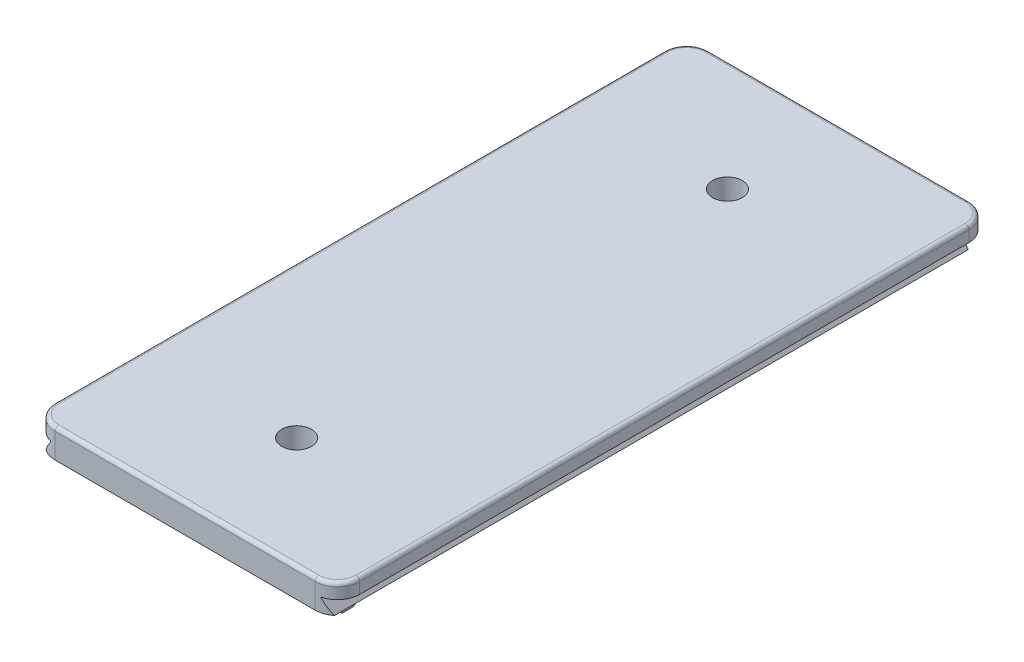
ISO-10303-21;
HEADER;
FILE_DESCRIPTION(('STEP AP214'),'2;1');
FILE_NAME('part.step','',(''),(''),'','','');
FILE_SCHEMA(('AUTOMOTIVE_DESIGN { 1 0 10303 214 1 1 1 1 }'));
ENDSEC;
DATA;
#1=APPLICATION_CONTEXT('core data for automotive mechanical design processes');
#2=APPLICATION_PROTOCOL_DEFINITION('international standard','automotive_design',2000,#1);
#3=PRODUCT_CONTEXT('',#1,'mechanical');
#4=PRODUCT('Part','Part','',(#3));
#5=PRODUCT_RELATED_PRODUCT_CATEGORY('part','',(#4));
#6=PRODUCT_DEFINITION_FORMATION('','',#4);
#7=PRODUCT_DEFINITION_CONTEXT('part definition',#1,'design');
#8=PRODUCT_DEFINITION('design','',#6,#7);
#9=PRODUCT_DEFINITION_SHAPE('','',#8);
#10=(LENGTH_UNIT() NAMED_UNIT(*) SI_UNIT(.MILLI.,.METRE.));
#11=(NAMED_UNIT(*) PLANE_ANGLE_UNIT() SI_UNIT($,.RADIAN.));
#12=(NAMED_UNIT(*) SI_UNIT($,.STERADIAN.) SOLID_ANGLE_UNIT());
#13=UNCERTAINTY_MEASURE_WITH_UNIT(LENGTH_MEASURE(1.E-05),#10,'distance_accuracy_value','');
#14=(GEOMETRIC_REPRESENTATION_CONTEXT(3) GLOBAL_UNCERTAINTY_ASSIGNED_CONTEXT((#13)) GLOBAL_UNIT_ASSIGNED_CONTEXT((#10,
#11,#12)) REPRESENTATION_CONTEXT('',''));
#15=CARTESIAN_POINT('',(0.,0.,0.));
#16=DIRECTION('',(0.,0.,1.));
#17=DIRECTION('',(1.,0.,0.));
#18=AXIS2_PLACEMENT_3D('',#15,#16,#17);
#19=CARTESIAN_POINT('',(19.4201695446766,24.25,-127.180365467052));
#20=DIRECTION('',(0.,-1.,0.));
#21=DIRECTION('',(1.,0.,0.));
#22=AXIS2_PLACEMENT_3D('',#19,#20,#21);
#23=PLANE('',#22);
#24=CARTESIAN_POINT('',(0.,24.25,-73.));
#25=DIRECTION('',(0.,-1.,0.));
#26=DIRECTION('',(1.,0.,0.));
#27=AXIS2_PLACEMENT_3D('',#24,#25,#26);
#28=CIRCLE('',#27,2.);
#29=CARTESIAN_POINT('',(2.,24.25,-73.));
#30=VERTEX_POINT('',#29);
#31=EDGE_CURVE('E387',#30,#30,#28,.F.);
#32=ORIENTED_EDGE('',*,*,#31,.T.);
#33=EDGE_LOOP('',(#32));
#34=FACE_BOUND('',#33,.T.);
#35=CARTESIAN_POINT('',(0.,24.25,-15.));
#36=DIRECTION('',(0.,-1.,0.));
#37=DIRECTION('',(1.,0.,0.));
#38=AXIS2_PLACEMENT_3D('',#35,#36,#37);
#39=CIRCLE('',#38,2.);
#40=CARTESIAN_POINT('',(1.99999999999999,24.25,-15.));
#41=VERTEX_POINT('',#40);
#42=EDGE_CURVE('E382',#41,#41,#39,.F.);
#43=ORIENTED_EDGE('',*,*,#42,.T.);
#44=EDGE_LOOP('',(#43));
#45=FACE_BOUND('',#44,.T.);
#46=DIRECTION('',(1.,0.,0.));
#47=VECTOR('',#46,1.);
#48=CARTESIAN_POINT('',(19.4201695446766,24.25,-3.5));
#49=LINE('',#48,#47);
#50=CARTESIAN_POINT('',(-19.4201695446767,24.25,-3.5));
#51=VERTEX_POINT('',#50);
#52=CARTESIAN_POINT('',(19.4201695446766,24.25,-3.5));
#53=VERTEX_POINT('',#52);
#54=EDGE_CURVE('E213',#51,#53,#49,.T.);
#55=ORIENTED_EDGE('',*,*,#54,.F.);
#56=DIRECTION('',(0.,0.,1.));
#57=VECTOR('',#56,1.);
#58=CARTESIAN_POINT('',(-19.4201695446767,24.25,-127.180365467052));
#59=LINE('',#58,#57);
#60=CARTESIAN_POINT('',(-19.4201695446767,24.25,-86.));
#61=VERTEX_POINT('',#60);
#62=EDGE_CURVE('E212',#61,#51,#59,.T.);
#63=ORIENTED_EDGE('',*,*,#62,.F.);
#64=DIRECTION('',(-1.,0.,0.));
#65=VECTOR('',#64,1.);
#66=CARTESIAN_POINT('',(19.4201695446766,24.25,-86.));
#67=LINE('',#66,#65);
#68=CARTESIAN_POINT('',(19.4201695446766,24.25,-86.));
#69=VERTEX_POINT('',#68);
#70=EDGE_CURVE('E252',#69,#61,#67,.T.);
#71=ORIENTED_EDGE('',*,*,#70,.F.);
#72=DIRECTION('',(0.,0.,1.));
#73=VECTOR('',#72,1.);
#74=CARTESIAN_POINT('',(19.4201695446766,24.25,-127.180365467052));
#75=LINE('',#74,#73);
#76=EDGE_CURVE('E262',#69,#53,#75,.T.);
#77=ORIENTED_EDGE('',*,*,#76,.T.);
#78=EDGE_LOOP('',(#55,#63,#71,#77));
#79=FACE_BOUND('',#78,.T.);
#80=ADVANCED_FACE('F39',(#34,#45,#79),#23,.T.);
#81=CARTESIAN_POINT('',(18.5,26.,-86.));
#82=DIRECTION('',(0.,0.,1.));
#83=DIRECTION('',(1.,0.,0.));
#84=AXIS2_PLACEMENT_3D('',#81,#82,#83);
#85=PLANE('',#84);
#86=DIRECTION('',(-1.,0.,0.));
#87=VECTOR('',#86,1.);
#88=CARTESIAN_POINT('',(-20.5,26.1,-86.));
#89=LINE('',#88,#87);
#90=CARTESIAN_POINT('',(18.1948063528096,26.1,-86.));
#91=VERTEX_POINT('',#90);
#92=CARTESIAN_POINT('',(-18.1948063528096,26.1,-86.));
#93=VERTEX_POINT('',#92);
#94=EDGE_CURVE('E238',#91,#93,#89,.T.);
#95=ORIENTED_EDGE('',*,*,#94,.F.);
#96=DIRECTION('',(0.,-1.,0.));
#97=VECTOR('',#96,1.);
#98=CARTESIAN_POINT('',(18.1948063528096,26.,-86.));
#99=LINE('',#98,#97);
#100=CARTESIAN_POINT('',(18.1948063528096,26.,-86.));
#101=VERTEX_POINT('',#100);
#102=EDGE_CURVE('E242',#91,#101,#99,.T.);
#103=ORIENTED_EDGE('',*,*,#102,.T.);
#104=DIRECTION('',(0.573576436351041,-0.819152044288995,0.));
#105=VECTOR('',#104,1.);
#106=CARTESIAN_POINT('',(18.1948063528096,26.,-86.));
#107=LINE('',#106,#105);
#108=EDGE_CURVE('E254',#101,#69,#107,.T.);
#109=ORIENTED_EDGE('',*,*,#108,.T.);
#110=ORIENTED_EDGE('',*,*,#70,.T.);
#111=DIRECTION('',(0.573576436351057,0.819152044288984,0.));
#112=VECTOR('',#111,1.);
#113=CARTESIAN_POINT('',(-19.4201695446767,24.25,-86.));
#114=LINE('',#113,#112);
#115=CARTESIAN_POINT('',(-18.1948063528096,26.,-86.));
#116=VERTEX_POINT('',#115);
#117=EDGE_CURVE('E249',#61,#116,#114,.T.);
#118=ORIENTED_EDGE('',*,*,#117,.T.);
#119=DIRECTION('',(0.,1.,0.));
#120=VECTOR('',#119,1.);
#121=CARTESIAN_POINT('',(-18.1948063528096,26.,-86.));
#122=LINE('',#121,#120);
#123=EDGE_CURVE('E247',#116,#93,#122,.T.);
#124=ORIENTED_EDGE('',*,*,#123,.T.);
#125=EDGE_LOOP('',(#95,#103,#109,#110,#118,#124));
#126=FACE_BOUND('',#125,.T.);
#127=ADVANCED_FACE('F408',(#126),#85,.F.);
#128=CARTESIAN_POINT('',(18.1948063528096,26.,-127.180365467052));
#129=DIRECTION('',(1.,0.,0.));
#130=DIRECTION('',(0.,1.,0.));
#131=AXIS2_PLACEMENT_3D('',#128,#129,#130);
#132=PLANE('',#131);
#133=DIRECTION('',(0.,0.,1.));
#134=VECTOR('',#133,1.);
#135=CARTESIAN_POINT('',(18.1948063528096,26.1,-127.180365467052));
#136=LINE('',#135,#134);
#137=CARTESIAN_POINT('',(18.1948063528096,26.1,-0.0815682067083767));
#138=VERTEX_POINT('',#137);
#139=EDGE_CURVE('E259',#91,#138,#136,.T.);
#140=ORIENTED_EDGE('',*,*,#139,.T.);
#141=DIRECTION('',(0.,-1.,0.));
#142=VECTOR('',#141,1.);
#143=CARTESIAN_POINT('',(18.1948063528096,26.1,-0.081568206708378));
#144=LINE('',#143,#142);
#145=CARTESIAN_POINT('',(18.1948063528096,26.,-0.0815682067083767));
#146=VERTEX_POINT('',#145);
#147=EDGE_CURVE('E319',#138,#146,#144,.T.);
#148=ORIENTED_EDGE('',*,*,#147,.T.);
#149=DIRECTION('',(0.,0.,1.));
#150=VECTOR('',#149,1.);
#151=CARTESIAN_POINT('',(18.1948063528096,26.,-127.180365467052));
#152=LINE('',#151,#150);
#153=EDGE_CURVE('E250',#101,#146,#152,.T.);
#154=ORIENTED_EDGE('',*,*,#153,.F.);
#155=ORIENTED_EDGE('',*,*,#102,.F.);
#156=EDGE_LOOP('',(#140,#148,#154,#155));
#157=FACE_BOUND('',#156,.T.);
#158=ADVANCED_FACE('F486',(#157),#132,.T.);
#159=CARTESIAN_POINT('',(18.1948063528096,26.,-127.180365467052));
#160=DIRECTION('',(0.819152044288995,0.573576436351041,0.));
#161=DIRECTION('',(-0.573576436351041,0.819152044288995,0.));
#162=AXIS2_PLACEMENT_3D('',#159,#160,#161);
#163=PLANE('',#162);
#164=ORIENTED_EDGE('',*,*,#153,.T.);
#165=CARTESIAN_POINT('',(17.5,26.9922863078369,-3.));
#166=DIRECTION('',(0.819152044288995,0.573576436351041,0.));
#167=DIRECTION('',(0.573576436351041,-0.819152044288995,0.));
#168=AXIS2_PLACEMENT_3D('',#165,#166,#167);
#169=ELLIPSE('',#168,5.23034038686334,3.);
#170=CARTESIAN_POINT('',(19.4201695446766,24.25,-0.69501650337872));
#171=VERTEX_POINT('',#170);
#172=EDGE_CURVE('E321',#146,#171,#169,.T.);
#173=ORIENTED_EDGE('',*,*,#172,.T.);
#174=CARTESIAN_POINT('',(19.4201695446766,24.25,-1.5));
#175=VERTEX_POINT('',#174);
#176=EDGE_CURVE('E264',#175,#171,#75,.T.);
#177=ORIENTED_EDGE('',*,*,#176,.F.);
#178=DIRECTION('',(0.,0.,1.));
#179=VECTOR('',#178,1.);
#180=CARTESIAN_POINT('',(19.4201695446766,24.25,-1.5));
#181=LINE('',#180,#179);
#182=EDGE_CURVE('E228',#53,#175,#181,.T.);
#183=ORIENTED_EDGE('',*,*,#182,.F.);
#184=ORIENTED_EDGE('',*,*,#76,.F.);
#185=ORIENTED_EDGE('',*,*,#108,.F.);
#186=EDGE_LOOP('',(#164,#173,#177,#183,#184,#185));
#187=FACE_BOUND('',#186,.T.);
#188=ADVANCED_FACE('F403',(#187),#163,.T.);
#189=DIRECTION('',(1.,0.,0.));
#190=VECTOR('',#189,1.);
#191=CARTESIAN_POINT('',(19.4201695446766,24.25,0.));
#192=LINE('',#191,#190);
#193=CARTESIAN_POINT('',(-17.5,24.25,0.));
#194=VERTEX_POINT('',#193);
#195=CARTESIAN_POINT('',(17.5,24.25,0.));
#196=VERTEX_POINT('',#195);
#197=EDGE_CURVE('E246',#194,#196,#192,.T.);
#198=ORIENTED_EDGE('',*,*,#197,.F.);
#199=CARTESIAN_POINT('',(-17.5,24.25,-3.));
#200=DIRECTION('',(0.,-1.,0.));
#201=DIRECTION('',(1.,0.,0.));
#202=AXIS2_PLACEMENT_3D('',#199,#200,#201);
#203=CIRCLE('',#202,3.);
#204=CARTESIAN_POINT('',(-19.4201695446767,24.25,-0.695016503378776));
#205=VERTEX_POINT('',#204);
#206=EDGE_CURVE('E222',#194,#205,#203,.T.);
#207=ORIENTED_EDGE('',*,*,#206,.T.);
#208=CARTESIAN_POINT('',(-19.4201695446766,24.25,-1.5));
#209=VERTEX_POINT('',#208);
#210=EDGE_CURVE('E208',#209,#205,#59,.T.);
#211=ORIENTED_EDGE('',*,*,#210,.F.);
#212=DIRECTION('',(-1.,0.,0.));
#213=VECTOR('',#212,1.);
#214=CARTESIAN_POINT('',(19.4201695446766,24.25,-1.5));
#215=LINE('',#214,#213);
#216=EDGE_CURVE('E214',#175,#209,#215,.T.);
#217=ORIENTED_EDGE('',*,*,#216,.F.);
#218=ORIENTED_EDGE('',*,*,#176,.T.);
#219=CARTESIAN_POINT('',(17.5,24.25,-3.));
#220=DIRECTION('',(0.,-1.,0.));
#221=DIRECTION('',(1.,0.,0.));
#222=AXIS2_PLACEMENT_3D('',#219,#220,#221);
#223=CIRCLE('',#222,3.);
#224=EDGE_CURVE('E312',#171,#196,#223,.T.);
#225=ORIENTED_EDGE('',*,*,#224,.T.);
#226=EDGE_LOOP('',(#198,#207,#211,#217,#218,#225));
#227=FACE_BOUND('',#226,.T.);
#228=ADVANCED_FACE('F218',(#227),#23,.T.);
#229=CARTESIAN_POINT('',(-19.4201695446767,24.25,-127.180365467052));
#230=DIRECTION('',(-0.819152044288984,0.573576436351057,0.));
#231=DIRECTION('',(-0.573576436351057,-0.819152044288984,0.));
#232=AXIS2_PLACEMENT_3D('',#229,#230,#231);
#233=PLANE('',#232);
#234=ORIENTED_EDGE('',*,*,#210,.T.);
#235=CARTESIAN_POINT('',(-17.5,26.9922863078368,-3.));
#236=DIRECTION('',(-0.819152044288984,0.573576436351057,0.));
#237=DIRECTION('',(0.573576436351057,0.819152044288984,0.));
#238=AXIS2_PLACEMENT_3D('',#235,#236,#237);
#239=ELLIPSE('',#238,5.23034038686319,3.);
#240=CARTESIAN_POINT('',(-18.1948063528096,26.,-0.0815682067083767));
#241=VERTEX_POINT('',#240);
#242=EDGE_CURVE('E315',#205,#241,#239,.T.);
#243=ORIENTED_EDGE('',*,*,#242,.T.);
#244=DIRECTION('',(0.,0.,1.));
#245=VECTOR('',#244,1.);
#246=CARTESIAN_POINT('',(-18.1948063528096,26.,-127.180365467052));
#247=LINE('',#246,#245);
#248=EDGE_CURVE('E223',#116,#241,#247,.T.);
#249=ORIENTED_EDGE('',*,*,#248,.F.);
#250=ORIENTED_EDGE('',*,*,#117,.F.);
#251=ORIENTED_EDGE('',*,*,#62,.T.);
#252=DIRECTION('',(0.,0.,-1.));
#253=VECTOR('',#252,1.);
#254=CARTESIAN_POINT('',(-19.4201695446766,24.25,-3.5));
#255=LINE('',#254,#253);
#256=EDGE_CURVE('E192',#209,#51,#255,.T.);
#257=ORIENTED_EDGE('',*,*,#256,.F.);
#258=EDGE_LOOP('',(#234,#243,#249,#250,#251,#257));
#259=FACE_BOUND('',#258,.T.);
#260=ADVANCED_FACE('F207',(#259),#233,.T.);
#261=CARTESIAN_POINT('',(-18.1948063528096,26.,-127.180365467052));
#262=DIRECTION('',(-1.,0.,0.));
#263=DIRECTION('',(0.,0.,1.));
#264=AXIS2_PLACEMENT_3D('',#261,#262,#263);
#265=PLANE('',#264);
#266=ORIENTED_EDGE('',*,*,#248,.T.);
#267=DIRECTION('',(0.,1.,0.));
#268=VECTOR('',#267,1.);
#269=CARTESIAN_POINT('',(-18.1948063528096,26.,-0.081568206708378));
#270=LINE('',#269,#268);
#271=CARTESIAN_POINT('',(-18.1948063528096,26.1,-0.0815682067083754));
#272=VERTEX_POINT('',#271);
#273=EDGE_CURVE('E317',#241,#272,#270,.T.);
#274=ORIENTED_EDGE('',*,*,#273,.T.);
#275=DIRECTION('',(0.,0.,1.));
#276=VECTOR('',#275,1.);
#277=CARTESIAN_POINT('',(-18.1948063528096,26.1,-127.180365467052));
#278=LINE('',#277,#276);
#279=EDGE_CURVE('E268',#93,#272,#278,.T.);
#280=ORIENTED_EDGE('',*,*,#279,.F.);
#281=ORIENTED_EDGE('',*,*,#123,.F.);
#282=EDGE_LOOP('',(#266,#274,#280,#281));
#283=FACE_BOUND('',#282,.T.);
#284=ADVANCED_FACE('F413',(#283),#265,.T.);
#285=CARTESIAN_POINT('',(-18.1948063528096,26.1,-127.180365467052));
#286=DIRECTION('',(0.,-1.,0.));
#287=DIRECTION('',(0.,0.,-1.));
#288=AXIS2_PLACEMENT_3D('',#285,#286,#287);
#289=PLANE('',#288);
#290=DIRECTION('',(0.,0.,1.));
#291=VECTOR('',#290,1.);
#292=CARTESIAN_POINT('',(-20.5,26.1,-127.180365467052));
#293=LINE('',#292,#291);
#294=CARTESIAN_POINT('',(-20.5,26.1,-85.));
#295=VERTEX_POINT('',#294);
#296=CARTESIAN_POINT('',(-20.5,26.1,-3.));
#297=VERTEX_POINT('',#296);
#298=EDGE_CURVE('E271',#295,#297,#293,.T.);
#299=ORIENTED_EDGE('',*,*,#298,.F.);
#300=CARTESIAN_POINT('',(-17.5,26.1,-85.));
#301=DIRECTION('',(0.,-1.,0.));
#302=DIRECTION('',(0.,0.,-1.));
#303=AXIS2_PLACEMENT_3D('',#300,#301,#302);
#304=CIRCLE('',#303,3.);
#305=CARTESIAN_POINT('',(-17.5,26.1,-88.));
#306=VERTEX_POINT('',#305);
#307=EDGE_CURVE('E297',#295,#306,#304,.T.);
#308=ORIENTED_EDGE('',*,*,#307,.T.);
#309=DIRECTION('',(1.,0.,0.));
#310=VECTOR('',#309,1.);
#311=CARTESIAN_POINT('',(-20.5,26.1,-88.));
#312=LINE('',#311,#310);
#313=CARTESIAN_POINT('',(17.5,26.1,-88.));
#314=VERTEX_POINT('',#313);
#315=EDGE_CURVE('E243',#306,#314,#312,.T.);
#316=ORIENTED_EDGE('',*,*,#315,.T.);
#317=CARTESIAN_POINT('',(17.5,26.1,-85.));
#318=DIRECTION('',(0.,-1.,0.));
#319=DIRECTION('',(0.,0.,-1.));
#320=AXIS2_PLACEMENT_3D('',#317,#318,#319);
#321=CIRCLE('',#320,3.);
#322=CARTESIAN_POINT('',(20.5,26.1,-85.));
#323=VERTEX_POINT('',#322);
#324=EDGE_CURVE('E295',#314,#323,#321,.T.);
#325=ORIENTED_EDGE('',*,*,#324,.T.);
#326=DIRECTION('',(0.,0.,1.));
#327=VECTOR('',#326,1.);
#328=CARTESIAN_POINT('',(20.5,26.1,-127.180365467052));
#329=LINE('',#328,#327);
#330=CARTESIAN_POINT('',(20.5,26.1,-3.));
#331=VERTEX_POINT('',#330);
#332=EDGE_CURVE('E274',#323,#331,#329,.T.);
#333=ORIENTED_EDGE('',*,*,#332,.T.);
#334=CARTESIAN_POINT('',(17.5,26.1,-3.));
#335=DIRECTION('',(0.,-1.,0.));
#336=DIRECTION('',(0.,0.,-1.));
#337=AXIS2_PLACEMENT_3D('',#334,#335,#336);
#338=CIRCLE('',#337,3.);
#339=EDGE_CURVE('E291',#331,#138,#338,.T.);
#340=ORIENTED_EDGE('',*,*,#339,.T.);
#341=ORIENTED_EDGE('',*,*,#139,.F.);
#342=ORIENTED_EDGE('',*,*,#94,.T.);
#343=ORIENTED_EDGE('',*,*,#279,.T.);
#344=CARTESIAN_POINT('',(-17.5,26.1,-3.));
#345=DIRECTION('',(0.,-1.,0.));
#346=DIRECTION('',(0.,0.,-1.));
#347=AXIS2_PLACEMENT_3D('',#344,#345,#346);
#348=CIRCLE('',#347,3.);
#349=EDGE_CURVE('E293',#272,#297,#348,.T.);
#350=ORIENTED_EDGE('',*,*,#349,.T.);
#351=EDGE_LOOP('',(#299,#308,#316,#325,#333,#340,#341,#342,#343,#350));
#352=FACE_BOUND('',#351,.T.);
#353=ADVANCED_FACE('F422',(#352),#289,.T.);
#354=CARTESIAN_POINT('',(-20.5,26.1,-127.180365467052));
#355=DIRECTION('',(-1.,0.,0.));
#356=DIRECTION('',(0.,0.,1.));
#357=AXIS2_PLACEMENT_3D('',#354,#355,#356);
#358=PLANE('',#357);
#359=DIRECTION('',(0.,-1.,0.));
#360=VECTOR('',#359,1.);
#361=CARTESIAN_POINT('',(-20.5,28.1,-3.));
#362=LINE('',#361,#360);
#363=CARTESIAN_POINT('',(-20.5,27.6,-3.));
#364=VERTEX_POINT('',#363);
#365=EDGE_CURVE('E286',#297,#364,#362,.F.);
#366=ORIENTED_EDGE('',*,*,#365,.T.);
#367=DIRECTION('',(0.,0.,1.));
#368=VECTOR('',#367,1.);
#369=CARTESIAN_POINT('',(-20.5,27.6,-127.180365467052));
#370=LINE('',#369,#368);
#371=CARTESIAN_POINT('',(-20.5,27.6,-85.));
#372=VERTEX_POINT('',#371);
#373=EDGE_CURVE('E347',#364,#372,#370,.F.);
#374=ORIENTED_EDGE('',*,*,#373,.T.);
#375=DIRECTION('',(0.,-1.,0.));
#376=VECTOR('',#375,1.);
#377=CARTESIAN_POINT('',(-20.5,26.1,-85.));
#378=LINE('',#377,#376);
#379=EDGE_CURVE('E289',#372,#295,#378,.T.);
#380=ORIENTED_EDGE('',*,*,#379,.T.);
#381=ORIENTED_EDGE('',*,*,#298,.T.);
#382=EDGE_LOOP('',(#366,#374,#380,#381));
#383=FACE_BOUND('',#382,.T.);
#384=ADVANCED_FACE('F424',(#383),#358,.T.);
#385=CARTESIAN_POINT('',(-20.5,28.1,-127.180365467052));
#386=DIRECTION('',(0.,1.,0.));
#387=DIRECTION('',(0.,0.,1.));
#388=AXIS2_PLACEMENT_3D('',#385,#386,#387);
#389=PLANE('',#388);
#390=DIRECTION('',(0.,0.,1.));
#391=VECTOR('',#390,1.);
#392=CARTESIAN_POINT('',(20.,28.1,-127.180365467052));
#393=LINE('',#392,#391);
#394=CARTESIAN_POINT('',(20.,28.1,-3.));
#395=VERTEX_POINT('',#394);
#396=CARTESIAN_POINT('',(20.,28.1,-85.));
#397=VERTEX_POINT('',#396);
#398=EDGE_CURVE('E323',#395,#397,#393,.F.);
#399=ORIENTED_EDGE('',*,*,#398,.T.);
#400=CARTESIAN_POINT('',(17.5,28.1,-85.));
#401=DIRECTION('',(0.,1.,0.));
#402=DIRECTION('',(0.,0.,1.));
#403=AXIS2_PLACEMENT_3D('',#400,#401,#402);
#404=CIRCLE('',#403,2.5);
#405=CARTESIAN_POINT('',(17.5,28.1,-87.5));
#406=VERTEX_POINT('',#405);
#407=EDGE_CURVE('E337',#397,#406,#404,.T.);
#408=ORIENTED_EDGE('',*,*,#407,.T.);
#409=DIRECTION('',(-1.,0.,0.));
#410=VECTOR('',#409,1.);
#411=CARTESIAN_POINT('',(-17.5,28.1,-87.5));
#412=LINE('',#411,#410);
#413=CARTESIAN_POINT('',(-17.5,28.1,-87.5));
#414=VERTEX_POINT('',#413);
#415=EDGE_CURVE('E335',#406,#414,#412,.T.);
#416=ORIENTED_EDGE('',*,*,#415,.T.);
#417=CARTESIAN_POINT('',(-17.5,28.1,-85.));
#418=DIRECTION('',(0.,1.,0.));
#419=DIRECTION('',(0.,0.,1.));
#420=AXIS2_PLACEMENT_3D('',#417,#418,#419);
#421=CIRCLE('',#420,2.5);
#422=CARTESIAN_POINT('',(-20.,28.1,-85.));
#423=VERTEX_POINT('',#422);
#424=EDGE_CURVE('E333',#414,#423,#421,.T.);
#425=ORIENTED_EDGE('',*,*,#424,.T.);
#426=DIRECTION('',(0.,0.,1.));
#427=VECTOR('',#426,1.);
#428=CARTESIAN_POINT('',(-20.,28.1,-127.180365467052));
#429=LINE('',#428,#427);
#430=CARTESIAN_POINT('',(-20.,28.1,-3.));
#431=VERTEX_POINT('',#430);
#432=EDGE_CURVE('E331',#423,#431,#429,.T.);
#433=ORIENTED_EDGE('',*,*,#432,.T.);
#434=CARTESIAN_POINT('',(-17.5,28.1,-3.));
#435=DIRECTION('',(0.,1.,0.));
#436=DIRECTION('',(0.,0.,1.));
#437=AXIS2_PLACEMENT_3D('',#434,#435,#436);
#438=CIRCLE('',#437,2.5);
#439=CARTESIAN_POINT('',(-17.5,28.1,-0.5));
#440=VERTEX_POINT('',#439);
#441=EDGE_CURVE('E329',#431,#440,#438,.T.);
#442=ORIENTED_EDGE('',*,*,#441,.T.);
#443=DIRECTION('',(-1.,0.,0.));
#444=VECTOR('',#443,1.);
#445=CARTESIAN_POINT('',(17.5,28.1,-0.5));
#446=LINE('',#445,#444);
#447=CARTESIAN_POINT('',(17.5,28.1,-0.5));
#448=VERTEX_POINT('',#447);
#449=EDGE_CURVE('E327',#440,#448,#446,.F.);
#450=ORIENTED_EDGE('',*,*,#449,.T.);
#451=CARTESIAN_POINT('',(17.5,28.1,-3.));
#452=DIRECTION('',(0.,1.,0.));
#453=DIRECTION('',(0.,0.,1.));
#454=AXIS2_PLACEMENT_3D('',#451,#452,#453);
#455=CIRCLE('',#454,2.5);
#456=EDGE_CURVE('E325',#448,#395,#455,.T.);
#457=ORIENTED_EDGE('',*,*,#456,.T.);
#458=EDGE_LOOP('',(#399,#408,#416,#425,#433,#442,#450,#457));
#459=FACE_BOUND('',#458,.T.);
#460=CARTESIAN_POINT('',(0.,28.1,-73.));
#461=DIRECTION('',(0.,1.,0.));
#462=DIRECTION('',(0.,0.,1.));
#463=AXIS2_PLACEMENT_3D('',#460,#461,#462);
#464=CIRCLE('',#463,2.);
#465=CARTESIAN_POINT('',(0.,28.1,-71.));
#466=VERTEX_POINT('',#465);
#467=EDGE_CURVE('E231',#466,#466,#464,.T.);
#468=ORIENTED_EDGE('',*,*,#467,.F.);
#469=EDGE_LOOP('',(#468));
#470=FACE_BOUND('',#469,.T.);
#471=CARTESIAN_POINT('',(0.,28.1,-15.));
#472=DIRECTION('',(0.,1.,0.));
#473=DIRECTION('',(0.,0.,-1.));
#474=AXIS2_PLACEMENT_3D('',#471,#472,#473);
#475=CIRCLE('',#474,2.);
#476=CARTESIAN_POINT('',(0.,28.1,-17.));
#477=VERTEX_POINT('',#476);
#478=EDGE_CURVE('E376',#477,#477,#475,.T.);
#479=ORIENTED_EDGE('',*,*,#478,.F.);
#480=EDGE_LOOP('',(#479));
#481=FACE_BOUND('',#480,.T.);
#482=ADVANCED_FACE('F452',(#459,#470,#481),#389,.T.);
#483=CARTESIAN_POINT('',(20.5,26.1,-127.180365467052));
#484=DIRECTION('',(1.,0.,0.));
#485=DIRECTION('',(0.,0.,-1.));
#486=AXIS2_PLACEMENT_3D('',#483,#484,#485);
#487=PLANE('',#486);
#488=DIRECTION('',(0.,1.,0.));
#489=VECTOR('',#488,1.);
#490=CARTESIAN_POINT('',(20.5,28.1,-85.));
#491=LINE('',#490,#489);
#492=CARTESIAN_POINT('',(20.5,27.6,-85.));
#493=VERTEX_POINT('',#492);
#494=EDGE_CURVE('E306',#323,#493,#491,.T.);
#495=ORIENTED_EDGE('',*,*,#494,.T.);
#496=DIRECTION('',(0.,0.,1.));
#497=VECTOR('',#496,1.);
#498=CARTESIAN_POINT('',(20.5,27.6,-127.180365467052));
#499=LINE('',#498,#497);
#500=CARTESIAN_POINT('',(20.5,27.6,-3.));
#501=VERTEX_POINT('',#500);
#502=EDGE_CURVE('E11',#493,#501,#499,.T.);
#503=ORIENTED_EDGE('',*,*,#502,.T.);
#504=DIRECTION('',(0.,1.,0.));
#505=VECTOR('',#504,1.);
#506=CARTESIAN_POINT('',(20.5,26.1,-3.));
#507=LINE('',#506,#505);
#508=EDGE_CURVE('E304',#501,#331,#507,.F.);
#509=ORIENTED_EDGE('',*,*,#508,.T.);
#510=ORIENTED_EDGE('',*,*,#332,.F.);
#511=EDGE_LOOP('',(#495,#503,#509,#510));
#512=FACE_BOUND('',#511,.T.);
#513=ADVANCED_FACE('F504',(#512),#487,.T.);
#514=CARTESIAN_POINT('',(0.,0.,0.));
#515=DIRECTION('',(0.,0.,-1.));
#516=DIRECTION('',(-1.,0.,0.));
#517=AXIS2_PLACEMENT_3D('',#514,#515,#516);
#518=PLANE('',#517);
#519=DIRECTION('',(0.,1.,0.));
#520=VECTOR('',#519,1.);
#521=CARTESIAN_POINT('',(17.5,28.1,0.));
#522=LINE('',#521,#520);
#523=CARTESIAN_POINT('',(17.5,27.6,0.));
#524=VERTEX_POINT('',#523);
#525=EDGE_CURVE('E308',#196,#524,#522,.T.);
#526=ORIENTED_EDGE('',*,*,#525,.T.);
#527=DIRECTION('',(-1.,0.,0.));
#528=VECTOR('',#527,1.);
#529=CARTESIAN_POINT('',(-17.5,27.6,0.));
#530=LINE('',#529,#528);
#531=CARTESIAN_POINT('',(-17.5,27.6,0.));
#532=VERTEX_POINT('',#531);
#533=EDGE_CURVE('E351',#524,#532,#530,.T.);
#534=ORIENTED_EDGE('',*,*,#533,.T.);
#535=DIRECTION('',(0.,-1.,0.));
#536=VECTOR('',#535,1.);
#537=CARTESIAN_POINT('',(-17.5,26.1,0.));
#538=LINE('',#537,#536);
#539=EDGE_CURVE('E310',#532,#194,#538,.T.);
#540=ORIENTED_EDGE('',*,*,#539,.T.);
#541=ORIENTED_EDGE('',*,*,#197,.T.);
#542=EDGE_LOOP('',(#526,#534,#540,#541));
#543=FACE_BOUND('',#542,.T.);
#544=ADVANCED_FACE('F464',(#543),#518,.F.);
#545=CARTESIAN_POINT('',(-20.5,2.,-88.));
#546=DIRECTION('',(0.,0.,1.));
#547=DIRECTION('',(1.,0.,0.));
#548=AXIS2_PLACEMENT_3D('',#545,#546,#547);
#549=PLANE('',#548);
#550=DIRECTION('',(0.,-1.,0.));
#551=VECTOR('',#550,1.);
#552=CARTESIAN_POINT('',(-17.5,28.1,-88.));
#553=LINE('',#552,#551);
#554=CARTESIAN_POINT('',(-17.5,27.6,-88.));
#555=VERTEX_POINT('',#554);
#556=EDGE_CURVE('E301',#306,#555,#553,.F.);
#557=ORIENTED_EDGE('',*,*,#556,.T.);
#558=DIRECTION('',(-1.,0.,0.));
#559=VECTOR('',#558,1.);
#560=CARTESIAN_POINT('',(17.5,27.6,-88.));
#561=LINE('',#560,#559);
#562=CARTESIAN_POINT('',(17.5,27.6,-88.));
#563=VERTEX_POINT('',#562);
#564=EDGE_CURVE('E343',#555,#563,#561,.F.);
#565=ORIENTED_EDGE('',*,*,#564,.T.);
#566=DIRECTION('',(0.,1.,0.));
#567=VECTOR('',#566,1.);
#568=CARTESIAN_POINT('',(17.5,26.1,-88.));
#569=LINE('',#568,#567);
#570=EDGE_CURVE('E299',#563,#314,#569,.F.);
#571=ORIENTED_EDGE('',*,*,#570,.T.);
#572=ORIENTED_EDGE('',*,*,#315,.F.);
#573=EDGE_LOOP('',(#557,#565,#571,#572));
#574=FACE_BOUND('',#573,.T.);
#575=ADVANCED_FACE('F434',(#574),#549,.F.);
#576=CARTESIAN_POINT('',(19.4201695446766,24.,-1.5));
#577=DIRECTION('',(-1.,0.,0.));
#578=DIRECTION('',(0.,0.,1.));
#579=AXIS2_PLACEMENT_3D('',#576,#577,#578);
#580=PLANE('',#579);
#581=DIRECTION('',(0.,0.,1.));
#582=VECTOR('',#581,1.);
#583=CARTESIAN_POINT('',(19.4201695446766,24.,-1.5));
#584=LINE('',#583,#582);
#585=CARTESIAN_POINT('',(19.4201695446766,24.,-3.06698729810778));
#586=VERTEX_POINT('',#585);
#587=CARTESIAN_POINT('',(19.4201695446766,24.,-1.93301270189222));
#588=VERTEX_POINT('',#587);
#589=EDGE_CURVE('E237',#586,#588,#584,.T.);
#590=ORIENTED_EDGE('',*,*,#589,.F.);
#591=CARTESIAN_POINT('',(19.4201695446766,24.5,-3.06698729810778));
#592=DIRECTION('',(-1.,0.,0.));
#593=DIRECTION('',(0.,0.,1.));
#594=AXIS2_PLACEMENT_3D('',#591,#592,#593);
#595=CIRCLE('',#594,0.5);
#596=EDGE_CURVE('E201',#586,#53,#595,.F.);
#597=ORIENTED_EDGE('',*,*,#596,.T.);
#598=ORIENTED_EDGE('',*,*,#182,.T.);
#599=CARTESIAN_POINT('',(19.4201695446766,24.5,-1.93301270189222));
#600=DIRECTION('',(-1.,0.,0.));
#601=DIRECTION('',(0.,0.,1.));
#602=AXIS2_PLACEMENT_3D('',#599,#600,#601);
#603=CIRCLE('',#602,0.5);
#604=EDGE_CURVE('E227',#175,#588,#603,.F.);
#605=ORIENTED_EDGE('',*,*,#604,.T.);
#606=EDGE_LOOP('',(#590,#597,#598,#605));
#607=FACE_BOUND('',#606,.T.);
#608=ADVANCED_FACE('F400',(#607),#580,.F.);
#609=CARTESIAN_POINT('',(-19.4201695446766,24.,-3.5));
#610=DIRECTION('',(1.,0.,0.));
#611=DIRECTION('',(0.,0.,-1.));
#612=AXIS2_PLACEMENT_3D('',#609,#610,#611);
#613=PLANE('',#612);
#614=ORIENTED_EDGE('',*,*,#256,.T.);
#615=CARTESIAN_POINT('',(-19.4201695446766,24.5,-3.06698729810778));
#616=DIRECTION('',(1.,0.,0.));
#617=DIRECTION('',(0.,0.,-1.));
#618=AXIS2_PLACEMENT_3D('',#615,#616,#617);
#619=CIRCLE('',#618,0.5);
#620=CARTESIAN_POINT('',(-19.4201695446766,24.,-3.06698729810778));
#621=VERTEX_POINT('',#620);
#622=EDGE_CURVE('E200',#51,#621,#619,.F.);
#623=ORIENTED_EDGE('',*,*,#622,.T.);
#624=DIRECTION('',(0.,0.,-1.));
#625=VECTOR('',#624,1.);
#626=CARTESIAN_POINT('',(-19.4201695446766,24.,-3.5));
#627=LINE('',#626,#625);
#628=CARTESIAN_POINT('',(-19.4201695446766,24.,-1.93301270189222));
#629=VERTEX_POINT('',#628);
#630=EDGE_CURVE('E195',#629,#621,#627,.T.);
#631=ORIENTED_EDGE('',*,*,#630,.F.);
#632=CARTESIAN_POINT('',(-19.4201695446766,24.5,-1.93301270189222));
#633=DIRECTION('',(1.,0.,0.));
#634=DIRECTION('',(0.,0.,-1.));
#635=AXIS2_PLACEMENT_3D('',#632,#633,#634);
#636=CIRCLE('',#635,0.5);
#637=EDGE_CURVE('E189',#629,#209,#636,.F.);
#638=ORIENTED_EDGE('',*,*,#637,.T.);
#639=EDGE_LOOP('',(#614,#623,#631,#638));
#640=FACE_BOUND('',#639,.T.);
#641=ADVANCED_FACE('F191',(#640),#613,.F.);
#642=CARTESIAN_POINT('',(0.,24.,0.));
#643=DIRECTION('',(0.,1.,0.));
#644=DIRECTION('',(0.,0.,1.));
#645=AXIS2_PLACEMENT_3D('',#642,#643,#644);
#646=PLANE('',#645);
#647=ORIENTED_EDGE('',*,*,#630,.T.);
#648=DIRECTION('',(1.,0.,0.));
#649=VECTOR('',#648,1.);
#650=CARTESIAN_POINT('',(0.,24.,-3.06698729810778));
#651=LINE('',#650,#649);
#652=EDGE_CURVE('E280',#621,#586,#651,.T.);
#653=ORIENTED_EDGE('',*,*,#652,.T.);
#654=ORIENTED_EDGE('',*,*,#589,.T.);
#655=DIRECTION('',(-1.,0.,0.));
#656=VECTOR('',#655,1.);
#657=CARTESIAN_POINT('',(0.,24.,-1.93301270189222));
#658=LINE('',#657,#656);
#659=EDGE_CURVE('E241',#588,#629,#658,.T.);
#660=ORIENTED_EDGE('',*,*,#659,.T.);
#661=EDGE_LOOP('',(#647,#653,#654,#660));
#662=FACE_BOUND('',#661,.T.);
#663=ADVANCED_FACE('F394',(#662),#646,.F.);
#664=CARTESIAN_POINT('',(19.4201695446766,24.5,-3.06698729810778));
#665=DIRECTION('',(1.,0.,0.));
#666=DIRECTION('',(0.,1.,0.));
#667=AXIS2_PLACEMENT_3D('',#664,#665,#666);
#668=CYLINDRICAL_SURFACE('',#667,0.5);
#669=ORIENTED_EDGE('',*,*,#622,.F.);
#670=ORIENTED_EDGE('',*,*,#54,.T.);
#671=ORIENTED_EDGE('',*,*,#596,.F.);
#672=ORIENTED_EDGE('',*,*,#652,.F.);
#673=EDGE_LOOP('',(#669,#670,#671,#672));
#674=FACE_BOUND('',#673,.T.);
#675=ADVANCED_FACE('F397',(#674),#668,.T.);
#676=CARTESIAN_POINT('',(19.4201695446766,24.5,-1.93301270189222));
#677=DIRECTION('',(-1.,0.,0.));
#678=DIRECTION('',(0.,-1.,0.));
#679=AXIS2_PLACEMENT_3D('',#676,#677,#678);
#680=CYLINDRICAL_SURFACE('',#679,0.5);
#681=ORIENTED_EDGE('',*,*,#604,.F.);
#682=ORIENTED_EDGE('',*,*,#216,.T.);
#683=ORIENTED_EDGE('',*,*,#637,.F.);
#684=ORIENTED_EDGE('',*,*,#659,.F.);
#685=EDGE_LOOP('',(#681,#682,#683,#684));
#686=FACE_BOUND('',#685,.T.);
#687=ADVANCED_FACE('F226',(#686),#680,.T.);
#688=CARTESIAN_POINT('',(-17.5,26.1,-85.));
#689=DIRECTION('',(0.,1.,0.));
#690=DIRECTION('',(0.,0.,1.));
#691=AXIS2_PLACEMENT_3D('',#688,#689,#690);
#692=CYLINDRICAL_SURFACE('',#691,3.);
#693=ORIENTED_EDGE('',*,*,#379,.F.);
#694=CARTESIAN_POINT('',(-17.5,27.6,-85.));
#695=DIRECTION('',(0.,1.,0.));
#696=DIRECTION('',(0.,0.,1.));
#697=AXIS2_PLACEMENT_3D('',#694,#695,#696);
#698=CIRCLE('',#697,3.);
#699=EDGE_CURVE('E345',#372,#555,#698,.F.);
#700=ORIENTED_EDGE('',*,*,#699,.T.);
#701=ORIENTED_EDGE('',*,*,#556,.F.);
#702=ORIENTED_EDGE('',*,*,#307,.F.);
#703=EDGE_LOOP('',(#693,#700,#701,#702));
#704=FACE_BOUND('',#703,.T.);
#705=ADVANCED_FACE('F430',(#704),#692,.T.);
#706=CARTESIAN_POINT('',(17.5,26.1,-85.));
#707=DIRECTION('',(0.,-1.,0.));
#708=DIRECTION('',(0.,0.,-1.));
#709=AXIS2_PLACEMENT_3D('',#706,#707,#708);
#710=CYLINDRICAL_SURFACE('',#709,3.);
#711=ORIENTED_EDGE('',*,*,#570,.F.);
#712=CARTESIAN_POINT('',(17.5,27.6,-85.));
#713=DIRECTION('',(0.,1.,0.));
#714=DIRECTION('',(0.,0.,1.));
#715=AXIS2_PLACEMENT_3D('',#712,#713,#714);
#716=CIRCLE('',#715,3.);
#717=EDGE_CURVE('E340',#563,#493,#716,.F.);
#718=ORIENTED_EDGE('',*,*,#717,.T.);
#719=ORIENTED_EDGE('',*,*,#494,.F.);
#720=ORIENTED_EDGE('',*,*,#324,.F.);
#721=EDGE_LOOP('',(#711,#718,#719,#720));
#722=FACE_BOUND('',#721,.T.);
#723=ADVANCED_FACE('F440',(#722),#710,.T.);
#724=CARTESIAN_POINT('',(-17.5,0.,-3.));
#725=DIRECTION('',(0.,1.,0.));
#726=DIRECTION('',(0.,0.,1.));
#727=AXIS2_PLACEMENT_3D('',#724,#725,#726);
#728=CYLINDRICAL_SURFACE('',#727,3.);
#729=ORIENTED_EDGE('',*,*,#539,.F.);
#730=CARTESIAN_POINT('',(-17.5,27.6,-3.));
#731=DIRECTION('',(0.,1.,0.));
#732=DIRECTION('',(0.,0.,1.));
#733=AXIS2_PLACEMENT_3D('',#730,#731,#732);
#734=CIRCLE('',#733,3.);
#735=EDGE_CURVE('E349',#532,#364,#734,.F.);
#736=ORIENTED_EDGE('',*,*,#735,.T.);
#737=ORIENTED_EDGE('',*,*,#365,.F.);
#738=ORIENTED_EDGE('',*,*,#349,.F.);
#739=ORIENTED_EDGE('',*,*,#273,.F.);
#740=ORIENTED_EDGE('',*,*,#242,.F.);
#741=ORIENTED_EDGE('',*,*,#206,.F.);
#742=EDGE_LOOP('',(#729,#736,#737,#738,#739,#740,#741));
#743=FACE_BOUND('',#742,.T.);
#744=ADVANCED_FACE('F418',(#743),#728,.T.);
#745=CARTESIAN_POINT('',(17.5,0.,-3.));
#746=DIRECTION('',(0.,-1.,0.));
#747=DIRECTION('',(0.,0.,-1.));
#748=AXIS2_PLACEMENT_3D('',#745,#746,#747);
#749=CYLINDRICAL_SURFACE('',#748,3.);
#750=ORIENTED_EDGE('',*,*,#508,.F.);
#751=CARTESIAN_POINT('',(17.5,27.6,-3.));
#752=DIRECTION('',(0.,1.,0.));
#753=DIRECTION('',(0.,0.,1.));
#754=AXIS2_PLACEMENT_3D('',#751,#752,#753);
#755=CIRCLE('',#754,3.);
#756=EDGE_CURVE('E48',#501,#524,#755,.F.);
#757=ORIENTED_EDGE('',*,*,#756,.T.);
#758=ORIENTED_EDGE('',*,*,#525,.F.);
#759=ORIENTED_EDGE('',*,*,#224,.F.);
#760=ORIENTED_EDGE('',*,*,#172,.F.);
#761=ORIENTED_EDGE('',*,*,#147,.F.);
#762=ORIENTED_EDGE('',*,*,#339,.F.);
#763=EDGE_LOOP('',(#750,#757,#758,#759,#760,#761,#762));
#764=FACE_BOUND('',#763,.T.);
#765=ADVANCED_FACE('F518',(#764),#749,.T.);
#766=CARTESIAN_POINT('',(0.,23.999,-15.));
#767=DIRECTION('',(0.,1.,0.));
#768=DIRECTION('',(0.,0.,1.));
#769=AXIS2_PLACEMENT_3D('',#766,#767,#768);
#770=CYLINDRICAL_SURFACE('',#769,2.);
#771=ORIENTED_EDGE('',*,*,#42,.F.);
#772=EDGE_LOOP('',(#771));
#773=FACE_BOUND('',#772,.T.);
#774=ORIENTED_EDGE('',*,*,#478,.T.);
#775=EDGE_LOOP('',(#774));
#776=FACE_BOUND('',#775,.T.);
#777=ADVANCED_FACE('F514',(#773,#776),#770,.F.);
#778=CARTESIAN_POINT('',(0.,23.999,-73.));
#779=DIRECTION('',(0.,1.,0.));
#780=DIRECTION('',(0.,0.,1.));
#781=AXIS2_PLACEMENT_3D('',#778,#779,#780);
#782=CYLINDRICAL_SURFACE('',#781,2.);
#783=ORIENTED_EDGE('',*,*,#31,.F.);
#784=EDGE_LOOP('',(#783));
#785=FACE_BOUND('',#784,.T.);
#786=ORIENTED_EDGE('',*,*,#467,.T.);
#787=EDGE_LOOP('',(#786));
#788=FACE_BOUND('',#787,.T.);
#789=ADVANCED_FACE('F517',(#785,#788),#782,.F.);
#790=CARTESIAN_POINT('',(-17.5,27.6,-3.));
#791=DIRECTION('',(0.,1.,0.));
#792=DIRECTION('',(0.,0.,1.));
#793=AXIS2_PLACEMENT_3D('',#790,#791,#792);
#794=TOROIDAL_SURFACE('',#793,2.5,0.5);
#795=CARTESIAN_POINT('',(-20.,27.6,-3.));
#796=DIRECTION('',(0.,0.,-1.));
#797=DIRECTION('',(-1.,0.,0.));
#798=AXIS2_PLACEMENT_3D('',#795,#796,#797);
#799=CIRCLE('',#798,0.5);
#800=EDGE_CURVE('E369',#364,#431,#799,.T.);
#801=ORIENTED_EDGE('',*,*,#800,.F.);
#802=ORIENTED_EDGE('',*,*,#735,.F.);
#803=CARTESIAN_POINT('',(-17.5,27.6,-0.5));
#804=DIRECTION('',(1.,0.,0.));
#805=DIRECTION('',(0.,0.,-1.));
#806=AXIS2_PLACEMENT_3D('',#803,#804,#805);
#807=CIRCLE('',#806,0.5);
#808=EDGE_CURVE('E43',#440,#532,#807,.T.);
#809=ORIENTED_EDGE('',*,*,#808,.F.);
#810=ORIENTED_EDGE('',*,*,#441,.F.);
#811=EDGE_LOOP('',(#801,#802,#809,#810));
#812=FACE_BOUND('',#811,.T.);
#813=ADVANCED_FACE('F41',(#812),#794,.T.);
#814=CARTESIAN_POINT('',(0.,27.6,-0.5));
#815=DIRECTION('',(1.,0.,0.));
#816=DIRECTION('',(0.,0.,-1.));
#817=AXIS2_PLACEMENT_3D('',#814,#815,#816);
#818=CYLINDRICAL_SURFACE('',#817,0.5);
#819=ORIENTED_EDGE('',*,*,#808,.T.);
#820=ORIENTED_EDGE('',*,*,#533,.F.);
#821=CARTESIAN_POINT('',(17.5,27.6,-0.5));
#822=DIRECTION('',(1.,0.,0.));
#823=DIRECTION('',(0.,0.,-1.));
#824=AXIS2_PLACEMENT_3D('',#821,#822,#823);
#825=CIRCLE('',#824,0.5);
#826=EDGE_CURVE('E367',#448,#524,#825,.T.);
#827=ORIENTED_EDGE('',*,*,#826,.F.);
#828=ORIENTED_EDGE('',*,*,#449,.F.);
#829=EDGE_LOOP('',(#819,#820,#827,#828));
#830=FACE_BOUND('',#829,.T.);
#831=ADVANCED_FACE('F462',(#830),#818,.T.);
#832=CARTESIAN_POINT('',(-20.,27.6,-127.180365467052));
#833=DIRECTION('',(0.,0.,1.));
#834=DIRECTION('',(1.,0.,0.));
#835=AXIS2_PLACEMENT_3D('',#832,#833,#834);
#836=CYLINDRICAL_SURFACE('',#835,0.5);
#837=ORIENTED_EDGE('',*,*,#800,.T.);
#838=ORIENTED_EDGE('',*,*,#432,.F.);
#839=CARTESIAN_POINT('',(-20.,27.6,-85.));
#840=DIRECTION('',(0.,0.,-1.));
#841=DIRECTION('',(-1.,0.,0.));
#842=AXIS2_PLACEMENT_3D('',#839,#840,#841);
#843=CIRCLE('',#842,0.5);
#844=EDGE_CURVE('E364',#372,#423,#843,.T.);
#845=ORIENTED_EDGE('',*,*,#844,.F.);
#846=ORIENTED_EDGE('',*,*,#373,.F.);
#847=EDGE_LOOP('',(#837,#838,#845,#846));
#848=FACE_BOUND('',#847,.T.);
#849=ADVANCED_FACE('F468',(#848),#836,.T.);
#850=CARTESIAN_POINT('',(17.5,27.6,-3.));
#851=DIRECTION('',(0.,1.,0.));
#852=DIRECTION('',(0.,0.,1.));
#853=AXIS2_PLACEMENT_3D('',#850,#851,#852);
#854=TOROIDAL_SURFACE('',#853,2.5,0.5);
#855=ORIENTED_EDGE('',*,*,#826,.T.);
#856=ORIENTED_EDGE('',*,*,#756,.F.);
#857=CARTESIAN_POINT('',(20.,27.6,-3.));
#858=DIRECTION('',(0.,0.,-1.));
#859=DIRECTION('',(-1.,0.,0.));
#860=AXIS2_PLACEMENT_3D('',#857,#858,#859);
#861=CIRCLE('',#860,0.5);
#862=EDGE_CURVE('E361',#395,#501,#861,.T.);
#863=ORIENTED_EDGE('',*,*,#862,.F.);
#864=ORIENTED_EDGE('',*,*,#456,.F.);
#865=EDGE_LOOP('',(#855,#856,#863,#864));
#866=FACE_BOUND('',#865,.T.);
#867=ADVANCED_FACE('F460',(#866),#854,.T.);
#868=CARTESIAN_POINT('',(-17.5,27.6,-85.));
#869=DIRECTION('',(0.,1.,0.));
#870=DIRECTION('',(0.,0.,1.));
#871=AXIS2_PLACEMENT_3D('',#868,#869,#870);
#872=TOROIDAL_SURFACE('',#871,2.5,0.5);
#873=ORIENTED_EDGE('',*,*,#844,.T.);
#874=ORIENTED_EDGE('',*,*,#424,.F.);
#875=CARTESIAN_POINT('',(-17.5,27.6,-87.5));
#876=DIRECTION('',(1.,0.,0.));
#877=DIRECTION('',(0.,0.,-1.));
#878=AXIS2_PLACEMENT_3D('',#875,#876,#877);
#879=CIRCLE('',#878,0.5);
#880=EDGE_CURVE('E358',#555,#414,#879,.T.);
#881=ORIENTED_EDGE('',*,*,#880,.F.);
#882=ORIENTED_EDGE('',*,*,#699,.F.);
#883=EDGE_LOOP('',(#873,#874,#881,#882));
#884=FACE_BOUND('',#883,.T.);
#885=ADVANCED_FACE('F471',(#884),#872,.T.);
#886=CARTESIAN_POINT('',(20.,27.6,-127.180365467052));
#887=DIRECTION('',(0.,0.,1.));
#888=DIRECTION('',(1.,0.,0.));
#889=AXIS2_PLACEMENT_3D('',#886,#887,#888);
#890=CYLINDRICAL_SURFACE('',#889,0.5);
#891=ORIENTED_EDGE('',*,*,#862,.T.);
#892=ORIENTED_EDGE('',*,*,#502,.F.);
#893=CARTESIAN_POINT('',(20.,27.6,-85.));
#894=DIRECTION('',(0.,0.,-1.));
#895=DIRECTION('',(-1.,0.,0.));
#896=AXIS2_PLACEMENT_3D('',#893,#894,#895);
#897=CIRCLE('',#896,0.5);
#898=EDGE_CURVE('E356',#397,#493,#897,.T.);
#899=ORIENTED_EDGE('',*,*,#898,.F.);
#900=ORIENTED_EDGE('',*,*,#398,.F.);
#901=EDGE_LOOP('',(#891,#892,#899,#900));
#902=FACE_BOUND('',#901,.T.);
#903=ADVANCED_FACE('F458',(#902),#890,.T.);
#904=CARTESIAN_POINT('',(-20.5,27.6,-87.5));
#905=DIRECTION('',(1.,0.,0.));
#906=DIRECTION('',(0.,0.,-1.));
#907=AXIS2_PLACEMENT_3D('',#904,#905,#906);
#908=CYLINDRICAL_SURFACE('',#907,0.5);
#909=ORIENTED_EDGE('',*,*,#880,.T.);
#910=ORIENTED_EDGE('',*,*,#415,.F.);
#911=CARTESIAN_POINT('',(17.5,27.6,-87.5));
#912=DIRECTION('',(1.,0.,0.));
#913=DIRECTION('',(0.,0.,-1.));
#914=AXIS2_PLACEMENT_3D('',#911,#912,#913);
#915=CIRCLE('',#914,0.5);
#916=EDGE_CURVE('E354',#563,#406,#915,.T.);
#917=ORIENTED_EDGE('',*,*,#916,.F.);
#918=ORIENTED_EDGE('',*,*,#564,.F.);
#919=EDGE_LOOP('',(#909,#910,#917,#918));
#920=FACE_BOUND('',#919,.T.);
#921=ADVANCED_FACE('F449',(#920),#908,.T.);
#922=CARTESIAN_POINT('',(17.5,27.6,-85.));
#923=DIRECTION('',(0.,1.,0.));
#924=DIRECTION('',(0.,0.,1.));
#925=AXIS2_PLACEMENT_3D('',#922,#923,#924);
#926=TOROIDAL_SURFACE('',#925,2.5,0.5);
#927=ORIENTED_EDGE('',*,*,#898,.T.);
#928=ORIENTED_EDGE('',*,*,#717,.F.);
#929=ORIENTED_EDGE('',*,*,#916,.T.);
#930=ORIENTED_EDGE('',*,*,#407,.F.);
#931=EDGE_LOOP('',(#927,#928,#929,#930));
#932=FACE_BOUND('',#931,.T.);
#933=ADVANCED_FACE('F444',(#932),#926,.T.);
#934=CLOSED_SHELL('',(#80,#127,#158,#188,#228,#260,#284,#353,#384,#482,#513,#544,#575,#608,#641,
#663,#675,#687,#705,#723,#744,#765,#777,#789,#813,#831,#849,#867,#885,#903,#921,#933));
#935=MANIFOLD_SOLID_BREP('B2',#934);
#936=ADVANCED_BREP_SHAPE_REPRESENTATION('',(#18,#935),#14);
#937=SHAPE_DEFINITION_REPRESENTATION(#9,#936);
ENDSEC;
END-ISO-10303-21;
